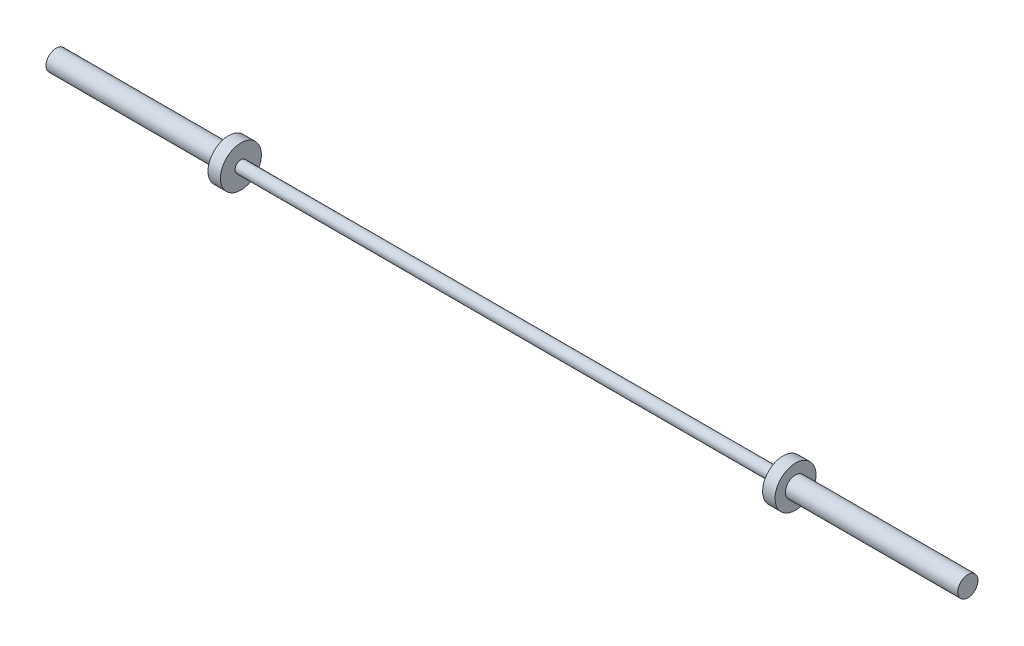
ISO-10303-21;
HEADER;
FILE_DESCRIPTION(('STEP AP214'),'2;1');
FILE_NAME('part.step','',(''),(''),'','','');
FILE_SCHEMA(('AUTOMOTIVE_DESIGN { 1 0 10303 214 1 1 1 1 }'));
ENDSEC;
DATA;
#1=APPLICATION_CONTEXT('core data for automotive mechanical design processes');
#2=APPLICATION_PROTOCOL_DEFINITION('international standard','automotive_design',2000,#1);
#3=PRODUCT_CONTEXT('',#1,'mechanical');
#4=PRODUCT('Part','Part','',(#3));
#5=PRODUCT_RELATED_PRODUCT_CATEGORY('part','',(#4));
#6=PRODUCT_DEFINITION_FORMATION('','',#4);
#7=PRODUCT_DEFINITION_CONTEXT('part definition',#1,'design');
#8=PRODUCT_DEFINITION('design','',#6,#7);
#9=PRODUCT_DEFINITION_SHAPE('','',#8);
#10=(LENGTH_UNIT() NAMED_UNIT(*) SI_UNIT(.MILLI.,.METRE.));
#11=(NAMED_UNIT(*) PLANE_ANGLE_UNIT() SI_UNIT($,.RADIAN.));
#12=(NAMED_UNIT(*) SI_UNIT($,.STERADIAN.) SOLID_ANGLE_UNIT());
#13=UNCERTAINTY_MEASURE_WITH_UNIT(LENGTH_MEASURE(1.E-05),#10,'distance_accuracy_value','');
#14=(GEOMETRIC_REPRESENTATION_CONTEXT(3) GLOBAL_UNCERTAINTY_ASSIGNED_CONTEXT((#13)) GLOBAL_UNIT_ASSIGNED_CONTEXT((#10,
#11,#12)) REPRESENTATION_CONTEXT('',''));
#15=CARTESIAN_POINT('',(0.,0.,0.));
#16=DIRECTION('',(0.,0.,1.));
#17=DIRECTION('',(1.,0.,0.));
#18=AXIS2_PLACEMENT_3D('',#15,#16,#17);
#19=CARTESIAN_POINT('',(-655.165,81.9160681399632,0.));
#20=DIRECTION('',(-1.,0.,0.));
#21=DIRECTION('',(0.,-1.,0.));
#22=AXIS2_PLACEMENT_3D('',#19,#20,#21);
#23=PLANE('',#22);
#24=CARTESIAN_POINT('',(-655.165,32.4160681399632,0.));
#25=DIRECTION('',(-1.,0.,0.));
#26=DIRECTION('',(0.,-1.,0.));
#27=AXIS2_PLACEMENT_3D('',#24,#25,#26);
#28=CIRCLE('',#27,49.5);
#29=CARTESIAN_POINT('',(-655.165,-17.0839318600368,0.));
#30=VERTEX_POINT('',#29);
#31=EDGE_CURVE('E68',#30,#30,#28,.T.);
#32=ORIENTED_EDGE('',*,*,#31,.F.);
#33=EDGE_LOOP('',(#32));
#34=FACE_BOUND('',#33,.T.);
#35=CARTESIAN_POINT('',(-655.165,32.4160681399632,0.));
#36=DIRECTION('',(-1.,0.,0.));
#37=DIRECTION('',(0.,-1.,0.));
#38=AXIS2_PLACEMENT_3D('',#35,#36,#37);
#39=CIRCLE('',#38,14.2500000000001);
#40=CARTESIAN_POINT('',(-655.165,18.1660681399631,0.));
#41=VERTEX_POINT('',#40);
#42=EDGE_CURVE('E10',#41,#41,#39,.T.);
#43=ORIENTED_EDGE('',*,*,#42,.T.);
#44=EDGE_LOOP('',(#43));
#45=FACE_BOUND('',#44,.T.);
#46=ADVANCED_FACE('F34',(#34,#45),#23,.F.);
#47=CARTESIAN_POINT('',(-1101.725,32.4160681399632,0.));
#48=DIRECTION('',(-1.,0.,0.));
#49=DIRECTION('',(0.,-1.,0.));
#50=AXIS2_PLACEMENT_3D('',#47,#48,#49);
#51=CYLINDRICAL_SURFACE('',#50,14.2500000000001);
#52=ORIENTED_EDGE('',*,*,#42,.F.);
#53=EDGE_LOOP('',(#52));
#54=FACE_BOUND('',#53,.T.);
#55=CARTESIAN_POINT('',(655.165,32.4160681399634,0.));
#56=DIRECTION('',(-1.,0.,0.));
#57=DIRECTION('',(0.,-1.,0.));
#58=AXIS2_PLACEMENT_3D('',#55,#56,#57);
#59=CIRCLE('',#58,14.2500000000001);
#60=CARTESIAN_POINT('',(655.165,18.1660681399633,0.));
#61=VERTEX_POINT('',#60);
#62=EDGE_CURVE('E40',#61,#61,#59,.T.);
#63=ORIENTED_EDGE('',*,*,#62,.T.);
#64=EDGE_LOOP('',(#63));
#65=FACE_BOUND('',#64,.T.);
#66=ADVANCED_FACE('F75',(#54,#65),#51,.T.);
#67=CARTESIAN_POINT('',(655.165,81.9160681399634,0.));
#68=DIRECTION('',(1.,0.,0.));
#69=DIRECTION('',(0.,1.,0.));
#70=AXIS2_PLACEMENT_3D('',#67,#68,#69);
#71=PLANE('',#70);
#72=ORIENTED_EDGE('',*,*,#62,.F.);
#73=EDGE_LOOP('',(#72));
#74=FACE_BOUND('',#73,.T.);
#75=CARTESIAN_POINT('',(655.165,32.4160681399634,0.));
#76=DIRECTION('',(-1.,0.,0.));
#77=DIRECTION('',(0.,-1.,0.));
#78=AXIS2_PLACEMENT_3D('',#75,#76,#77);
#79=CIRCLE('',#78,49.5);
#80=CARTESIAN_POINT('',(655.165,-17.0839318600366,0.));
#81=VERTEX_POINT('',#80);
#82=EDGE_CURVE('E44',#81,#81,#79,.T.);
#83=ORIENTED_EDGE('',*,*,#82,.T.);
#84=EDGE_LOOP('',(#83));
#85=FACE_BOUND('',#84,.T.);
#86=ADVANCED_FACE('F79',(#74,#85),#71,.F.);
#87=CARTESIAN_POINT('',(-1101.725,32.4160681399632,0.));
#88=DIRECTION('',(-1.,0.,0.));
#89=DIRECTION('',(0.,-1.,0.));
#90=AXIS2_PLACEMENT_3D('',#87,#88,#89);
#91=CYLINDRICAL_SURFACE('',#90,49.5);
#92=ORIENTED_EDGE('',*,*,#82,.F.);
#93=EDGE_LOOP('',(#92));
#94=FACE_BOUND('',#93,.T.);
#95=CARTESIAN_POINT('',(685.165,32.4160681399634,0.));
#96=DIRECTION('',(-1.,0.,0.));
#97=DIRECTION('',(0.,-1.,0.));
#98=AXIS2_PLACEMENT_3D('',#95,#96,#97);
#99=CIRCLE('',#98,49.5);
#100=CARTESIAN_POINT('',(685.165,-17.0839318600366,0.));
#101=VERTEX_POINT('',#100);
#102=EDGE_CURVE('E48',#101,#101,#99,.T.);
#103=ORIENTED_EDGE('',*,*,#102,.T.);
#104=EDGE_LOOP('',(#103));
#105=FACE_BOUND('',#104,.T.);
#106=ADVANCED_FACE('F84',(#94,#105),#91,.T.);
#107=CARTESIAN_POINT('',(685.165,56.9160681399634,0.));
#108=DIRECTION('',(-1.,0.,0.));
#109=DIRECTION('',(0.,-1.,0.));
#110=AXIS2_PLACEMENT_3D('',#107,#108,#109);
#111=PLANE('',#110);
#112=ORIENTED_EDGE('',*,*,#102,.F.);
#113=EDGE_LOOP('',(#112));
#114=FACE_BOUND('',#113,.T.);
#115=CARTESIAN_POINT('',(685.165,32.4160681399634,0.));
#116=DIRECTION('',(-1.,0.,0.));
#117=DIRECTION('',(0.,-1.,0.));
#118=AXIS2_PLACEMENT_3D('',#115,#116,#117);
#119=CIRCLE('',#118,24.5);
#120=CARTESIAN_POINT('',(685.165,7.91606813996339,0.));
#121=VERTEX_POINT('',#120);
#122=EDGE_CURVE('E53',#121,#121,#119,.T.);
#123=ORIENTED_EDGE('',*,*,#122,.T.);
#124=EDGE_LOOP('',(#123));
#125=FACE_BOUND('',#124,.T.);
#126=ADVANCED_FACE('F90',(#114,#125),#111,.F.);
#127=CARTESIAN_POINT('',(-1101.725,32.4160681399632,0.));
#128=DIRECTION('',(-1.,0.,0.));
#129=DIRECTION('',(0.,-1.,0.));
#130=AXIS2_PLACEMENT_3D('',#127,#128,#129);
#131=CYLINDRICAL_SURFACE('',#130,24.5);
#132=ORIENTED_EDGE('',*,*,#122,.F.);
#133=EDGE_LOOP('',(#132));
#134=FACE_BOUND('',#133,.T.);
#135=CARTESIAN_POINT('',(1101.725,32.4160681399634,0.));
#136=DIRECTION('',(-1.,0.,0.));
#137=DIRECTION('',(0.,-1.,0.));
#138=AXIS2_PLACEMENT_3D('',#135,#136,#137);
#139=CIRCLE('',#138,24.5);
#140=CARTESIAN_POINT('',(1101.725,7.91606813996345,0.));
#141=VERTEX_POINT('',#140);
#142=EDGE_CURVE('E56',#141,#141,#139,.T.);
#143=ORIENTED_EDGE('',*,*,#142,.T.);
#144=EDGE_LOOP('',(#143));
#145=FACE_BOUND('',#144,.T.);
#146=ADVANCED_FACE('F94',(#134,#145),#131,.T.);
#147=CARTESIAN_POINT('',(1101.725,32.4160681399634,0.));
#148=DIRECTION('',(-1.,0.,0.));
#149=DIRECTION('',(0.,-1.,0.));
#150=AXIS2_PLACEMENT_3D('',#147,#148,#149);
#151=PLANE('',#150);
#152=ORIENTED_EDGE('',*,*,#142,.F.);
#153=EDGE_LOOP('',(#152));
#154=FACE_BOUND('',#153,.T.);
#155=ADVANCED_FACE('F98',(#154),#151,.F.);
#156=CARTESIAN_POINT('',(-1101.725,32.4160681399632,0.));
#157=DIRECTION('',(1.,0.,0.));
#158=DIRECTION('',(0.,1.,0.));
#159=AXIS2_PLACEMENT_3D('',#156,#157,#158);
#160=PLANE('',#159);
#161=CARTESIAN_POINT('',(-1101.725,32.4160681399632,0.));
#162=DIRECTION('',(-1.,0.,0.));
#163=DIRECTION('',(0.,-1.,0.));
#164=AXIS2_PLACEMENT_3D('',#161,#162,#163);
#165=CIRCLE('',#164,24.5);
#166=CARTESIAN_POINT('',(-1101.725,7.91606813996318,0.));
#167=VERTEX_POINT('',#166);
#168=EDGE_CURVE('E59',#167,#167,#165,.T.);
#169=ORIENTED_EDGE('',*,*,#168,.T.);
#170=EDGE_LOOP('',(#169));
#171=FACE_BOUND('',#170,.T.);
#172=ADVANCED_FACE('F102',(#171),#160,.F.);
#173=CARTESIAN_POINT('',(-1101.725,32.4160681399632,0.));
#174=DIRECTION('',(-1.,0.,0.));
#175=DIRECTION('',(0.,-1.,0.));
#176=AXIS2_PLACEMENT_3D('',#173,#174,#175);
#177=CYLINDRICAL_SURFACE('',#176,24.5);
#178=ORIENTED_EDGE('',*,*,#168,.F.);
#179=EDGE_LOOP('',(#178));
#180=FACE_BOUND('',#179,.T.);
#181=CARTESIAN_POINT('',(-685.165,32.4160681399632,0.));
#182=DIRECTION('',(-1.,0.,0.));
#183=DIRECTION('',(0.,-1.,0.));
#184=AXIS2_PLACEMENT_3D('',#181,#182,#183);
#185=CIRCLE('',#184,24.5);
#186=CARTESIAN_POINT('',(-685.165,7.91606813996322,0.));
#187=VERTEX_POINT('',#186);
#188=EDGE_CURVE('E62',#187,#187,#185,.T.);
#189=ORIENTED_EDGE('',*,*,#188,.T.);
#190=EDGE_LOOP('',(#189));
#191=FACE_BOUND('',#190,.T.);
#192=ADVANCED_FACE('F106',(#180,#191),#177,.T.);
#193=CARTESIAN_POINT('',(-685.165,56.9160681399632,0.));
#194=DIRECTION('',(1.,0.,0.));
#195=DIRECTION('',(0.,1.,0.));
#196=AXIS2_PLACEMENT_3D('',#193,#194,#195);
#197=PLANE('',#196);
#198=ORIENTED_EDGE('',*,*,#188,.F.);
#199=EDGE_LOOP('',(#198));
#200=FACE_BOUND('',#199,.T.);
#201=CARTESIAN_POINT('',(-685.165,32.4160681399632,0.));
#202=DIRECTION('',(-1.,0.,0.));
#203=DIRECTION('',(0.,-1.,0.));
#204=AXIS2_PLACEMENT_3D('',#201,#202,#203);
#205=CIRCLE('',#204,49.5);
#206=CARTESIAN_POINT('',(-685.165,-17.0839318600368,0.));
#207=VERTEX_POINT('',#206);
#208=EDGE_CURVE('E65',#207,#207,#205,.T.);
#209=ORIENTED_EDGE('',*,*,#208,.T.);
#210=EDGE_LOOP('',(#209));
#211=FACE_BOUND('',#210,.T.);
#212=ADVANCED_FACE('F110',(#200,#211),#197,.F.);
#213=CARTESIAN_POINT('',(-1101.725,32.4160681399632,0.));
#214=DIRECTION('',(-1.,0.,0.));
#215=DIRECTION('',(0.,-1.,0.));
#216=AXIS2_PLACEMENT_3D('',#213,#214,#215);
#217=CYLINDRICAL_SURFACE('',#216,49.5);
#218=ORIENTED_EDGE('',*,*,#208,.F.);
#219=EDGE_LOOP('',(#218));
#220=FACE_BOUND('',#219,.T.);
#221=ORIENTED_EDGE('',*,*,#31,.T.);
#222=EDGE_LOOP('',(#221));
#223=FACE_BOUND('',#222,.T.);
#224=ADVANCED_FACE('F72',(#220,#223),#217,.T.);
#225=CLOSED_SHELL('',(#46,#66,#86,#106,#126,#146,#155,#172,#192,#212,#224));
#226=MANIFOLD_SOLID_BREP('B2',#225);
#227=ADVANCED_BREP_SHAPE_REPRESENTATION('',(#18,#226),#14);
#228=SHAPE_DEFINITION_REPRESENTATION(#9,#227);
ENDSEC;
END-ISO-10303-21;
